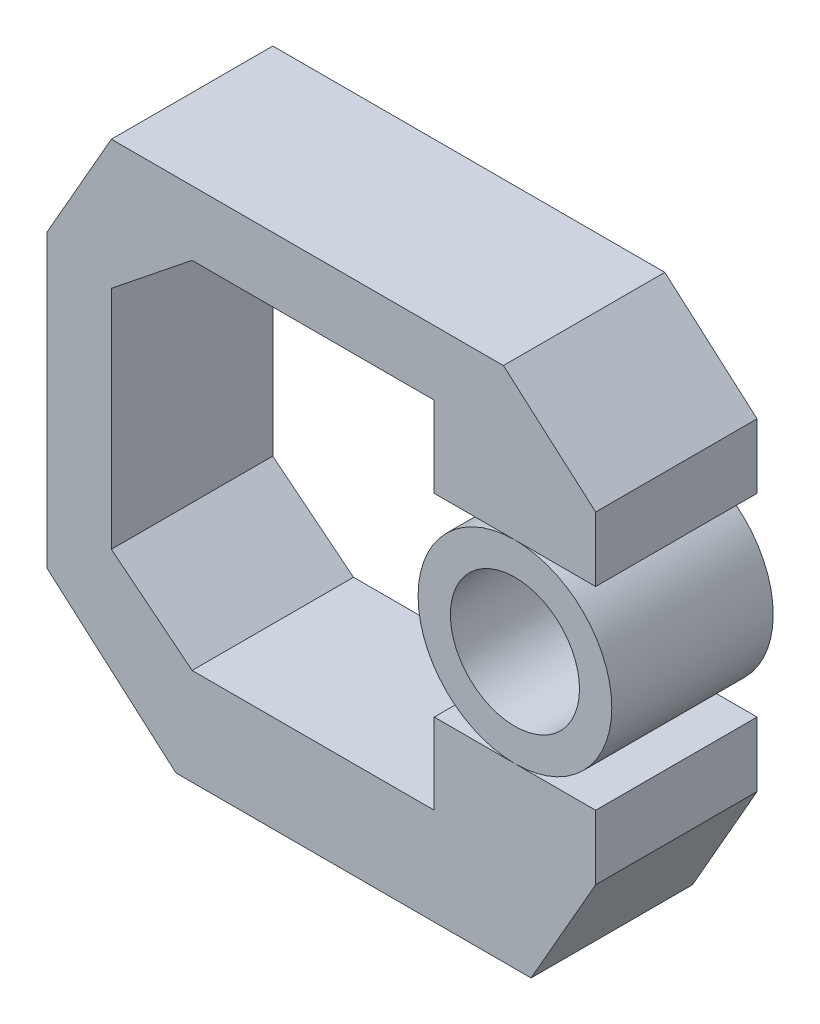
ISO-10303-21;
HEADER;
FILE_DESCRIPTION(('STEP AP214'),'2;1');
FILE_NAME('part.step','',(''),(''),'','','');
FILE_SCHEMA(('AUTOMOTIVE_DESIGN { 1 0 10303 214 1 1 1 1 }'));
ENDSEC;
DATA;
#1=APPLICATION_CONTEXT('core data for automotive mechanical design processes');
#2=APPLICATION_PROTOCOL_DEFINITION('international standard','automotive_design',2000,#1);
#3=PRODUCT_CONTEXT('',#1,'mechanical');
#4=PRODUCT('Part','Part','',(#3));
#5=PRODUCT_RELATED_PRODUCT_CATEGORY('part','',(#4));
#6=PRODUCT_DEFINITION_FORMATION('','',#4);
#7=PRODUCT_DEFINITION_CONTEXT('part definition',#1,'design');
#8=PRODUCT_DEFINITION('design','',#6,#7);
#9=PRODUCT_DEFINITION_SHAPE('','',#8);
#10=(LENGTH_UNIT() NAMED_UNIT(*) SI_UNIT(.MILLI.,.METRE.));
#11=(NAMED_UNIT(*) PLANE_ANGLE_UNIT() SI_UNIT($,.RADIAN.));
#12=(NAMED_UNIT(*) SI_UNIT($,.STERADIAN.) SOLID_ANGLE_UNIT());
#13=UNCERTAINTY_MEASURE_WITH_UNIT(LENGTH_MEASURE(1.E-05),#10,'distance_accuracy_value','');
#14=(GEOMETRIC_REPRESENTATION_CONTEXT(3) GLOBAL_UNCERTAINTY_ASSIGNED_CONTEXT((#13)) GLOBAL_UNIT_ASSIGNED_CONTEXT((#10,
#11,#12)) REPRESENTATION_CONTEXT('',''));
#15=CARTESIAN_POINT('',(0.,0.,0.));
#16=DIRECTION('',(0.,0.,1.));
#17=DIRECTION('',(1.,0.,0.));
#18=AXIS2_PLACEMENT_3D('',#15,#16,#17);
#19=CARTESIAN_POINT('',(0.,0.,5.));
#20=DIRECTION('',(0.,0.,-1.));
#21=DIRECTION('',(-1.,0.,0.));
#22=AXIS2_PLACEMENT_3D('',#19,#20,#21);
#23=CYLINDRICAL_SURFACE('',#22,4.);
#24=CARTESIAN_POINT('',(0.,0.,5.));
#25=DIRECTION('',(0.,0.,1.));
#26=DIRECTION('',(1.,0.,0.));
#27=AXIS2_PLACEMENT_3D('',#24,#25,#26);
#28=CIRCLE('',#27,4.);
#29=CARTESIAN_POINT('',(4.,0.,5.));
#30=VERTEX_POINT('',#29);
#31=EDGE_CURVE('E115',#30,#30,#28,.T.);
#32=ORIENTED_EDGE('',*,*,#31,.T.);
#33=EDGE_LOOP('',(#32));
#34=FACE_BOUND('',#33,.T.);
#35=CARTESIAN_POINT('',(0.,0.,-5.));
#36=DIRECTION('',(0.,0.,1.));
#37=DIRECTION('',(1.,0.,0.));
#38=AXIS2_PLACEMENT_3D('',#35,#36,#37);
#39=CIRCLE('',#38,4.);
#40=CARTESIAN_POINT('',(4.,0.,-5.));
#41=VERTEX_POINT('',#40);
#42=EDGE_CURVE('E121',#41,#41,#39,.T.);
#43=ORIENTED_EDGE('',*,*,#42,.F.);
#44=EDGE_LOOP('',(#43));
#45=FACE_BOUND('',#44,.T.);
#46=ADVANCED_FACE('F108',(#34,#45),#23,.F.);
#47=CARTESIAN_POINT('',(0.,0.,5.));
#48=DIRECTION('',(0.,0.,-1.));
#49=DIRECTION('',(-1.,0.,0.));
#50=AXIS2_PLACEMENT_3D('',#47,#48,#49);
#51=CYLINDRICAL_SURFACE('',#50,6.);
#52=CARTESIAN_POINT('',(0.,0.,5.));
#53=DIRECTION('',(0.,0.,1.));
#54=DIRECTION('',(1.,0.,0.));
#55=AXIS2_PLACEMENT_3D('',#52,#53,#54);
#56=CIRCLE('',#55,6.);
#57=CARTESIAN_POINT('',(6.,0.,5.));
#58=VERTEX_POINT('',#57);
#59=EDGE_CURVE('E12',#58,#58,#56,.T.);
#60=ORIENTED_EDGE('',*,*,#59,.F.);
#61=EDGE_LOOP('',(#60));
#62=FACE_BOUND('',#61,.T.);
#63=CARTESIAN_POINT('',(0.,0.,-5.));
#64=DIRECTION('',(0.,0.,1.));
#65=DIRECTION('',(1.,0.,0.));
#66=AXIS2_PLACEMENT_3D('',#63,#64,#65);
#67=CIRCLE('',#66,6.);
#68=CARTESIAN_POINT('',(6.,0.,-5.));
#69=VERTEX_POINT('',#68);
#70=EDGE_CURVE('E111',#69,#69,#67,.T.);
#71=ORIENTED_EDGE('',*,*,#70,.T.);
#72=EDGE_LOOP('',(#71));
#73=FACE_BOUND('',#72,.T.);
#74=ADVANCED_FACE('F128',(#62,#73),#51,.T.);
#75=CARTESIAN_POINT('',(0.,0.,5.));
#76=DIRECTION('',(0.,0.,1.));
#77=DIRECTION('',(1.,0.,0.));
#78=AXIS2_PLACEMENT_3D('',#75,#76,#77);
#79=PLANE('',#78);
#80=ORIENTED_EDGE('',*,*,#31,.F.);
#81=EDGE_LOOP('',(#80));
#82=FACE_BOUND('',#81,.T.);
#83=ORIENTED_EDGE('',*,*,#59,.T.);
#84=EDGE_LOOP('',(#83));
#85=FACE_BOUND('',#84,.T.);
#86=ADVANCED_FACE('F132',(#82,#85),#79,.T.);
#87=CARTESIAN_POINT('',(0.,0.,-5.));
#88=DIRECTION('',(0.,0.,1.));
#89=DIRECTION('',(1.,0.,0.));
#90=AXIS2_PLACEMENT_3D('',#87,#88,#89);
#91=PLANE('',#90);
#92=ORIENTED_EDGE('',*,*,#42,.T.);
#93=EDGE_LOOP('',(#92));
#94=FACE_BOUND('',#93,.T.);
#95=ORIENTED_EDGE('',*,*,#70,.F.);
#96=EDGE_LOOP('',(#95));
#97=FACE_BOUND('',#96,.T.);
#98=ADVANCED_FACE('F130',(#94,#97),#91,.F.);
#99=CLOSED_SHELL('',(#46,#74,#86,#98));
#100=MANIFOLD_SOLID_BREP('B2',#99);
#101=CARTESIAN_POINT('',(0.,11.,5.));
#102=DIRECTION('',(0.,-1.,0.));
#103=DIRECTION('',(1.,0.,0.));
#104=AXIS2_PLACEMENT_3D('',#101,#102,#103);
#105=PLANE('',#104);
#106=DIRECTION('',(-1.,0.,0.));
#107=VECTOR('',#106,1.);
#108=CARTESIAN_POINT('',(0.,11.,-5.));
#109=LINE('',#108,#107);
#110=CARTESIAN_POINT('',(-5.,11.,-5.));
#111=VERTEX_POINT('',#110);
#112=CARTESIAN_POINT('',(-20.,11.,-5.));
#113=VERTEX_POINT('',#112);
#114=EDGE_CURVE('E335',#111,#113,#109,.T.);
#115=ORIENTED_EDGE('',*,*,#114,.F.);
#116=DIRECTION('',(0.,0.,-1.));
#117=VECTOR('',#116,1.);
#118=CARTESIAN_POINT('',(-5.,11.,5.));
#119=LINE('',#118,#117);
#120=CARTESIAN_POINT('',(-5.,11.,5.));
#121=VERTEX_POINT('',#120);
#122=EDGE_CURVE('E106',#121,#111,#119,.T.);
#123=ORIENTED_EDGE('',*,*,#122,.F.);
#124=DIRECTION('',(-1.,0.,0.));
#125=VECTOR('',#124,1.);
#126=CARTESIAN_POINT('',(0.,11.,5.));
#127=LINE('',#126,#125);
#128=CARTESIAN_POINT('',(-20.,11.,5.));
#129=VERTEX_POINT('',#128);
#130=EDGE_CURVE('E400',#121,#129,#127,.T.);
#131=ORIENTED_EDGE('',*,*,#130,.T.);
#132=DIRECTION('',(0.,0.,-1.));
#133=VECTOR('',#132,1.);
#134=CARTESIAN_POINT('',(-20.,11.,5.));
#135=LINE('',#134,#133);
#136=EDGE_CURVE('E260',#129,#113,#135,.T.);
#137=ORIENTED_EDGE('',*,*,#136,.T.);
#138=EDGE_LOOP('',(#115,#123,#131,#137));
#139=FACE_BOUND('',#138,.T.);
#140=ADVANCED_FACE('F178',(#139),#105,.T.);
#141=CARTESIAN_POINT('',(-5.,0.,5.));
#142=DIRECTION('',(-1.,0.,0.));
#143=DIRECTION('',(0.,-1.,0.));
#144=AXIS2_PLACEMENT_3D('',#141,#142,#143);
#145=PLANE('',#144);
#146=DIRECTION('',(0.,1.,0.));
#147=VECTOR('',#146,1.);
#148=CARTESIAN_POINT('',(-5.,0.,-5.));
#149=LINE('',#148,#147);
#150=CARTESIAN_POINT('',(-5.,6.,-5.));
#151=VERTEX_POINT('',#150);
#152=EDGE_CURVE('E339',#151,#111,#149,.T.);
#153=ORIENTED_EDGE('',*,*,#152,.F.);
#154=DIRECTION('',(0.,0.,-1.));
#155=VECTOR('',#154,1.);
#156=CARTESIAN_POINT('',(-5.,6.,5.));
#157=LINE('',#156,#155);
#158=CARTESIAN_POINT('',(-5.,6.,5.));
#159=VERTEX_POINT('',#158);
#160=EDGE_CURVE('E187',#159,#151,#157,.T.);
#161=ORIENTED_EDGE('',*,*,#160,.F.);
#162=DIRECTION('',(0.,1.,0.));
#163=VECTOR('',#162,1.);
#164=CARTESIAN_POINT('',(-5.,0.,5.));
#165=LINE('',#164,#163);
#166=EDGE_CURVE('E466',#159,#121,#165,.T.);
#167=ORIENTED_EDGE('',*,*,#166,.T.);
#168=ORIENTED_EDGE('',*,*,#122,.T.);
#169=EDGE_LOOP('',(#153,#161,#167,#168));
#170=FACE_BOUND('',#169,.T.);
#171=ADVANCED_FACE('F454',(#170),#145,.T.);
#172=CARTESIAN_POINT('',(0.,6.,5.));
#173=DIRECTION('',(0.,-1.,0.));
#174=DIRECTION('',(0.,0.,-1.));
#175=AXIS2_PLACEMENT_3D('',#172,#173,#174);
#176=PLANE('',#175);
#177=DIRECTION('',(-1.,0.,0.));
#178=VECTOR('',#177,1.);
#179=CARTESIAN_POINT('',(0.,6.,-5.));
#180=LINE('',#179,#178);
#181=CARTESIAN_POINT('',(5.,6.,-5.));
#182=VERTEX_POINT('',#181);
#183=EDGE_CURVE('E343',#182,#151,#180,.T.);
#184=ORIENTED_EDGE('',*,*,#183,.F.);
#185=DIRECTION('',(0.,0.,-1.));
#186=VECTOR('',#185,1.);
#187=CARTESIAN_POINT('',(5.,6.,5.));
#188=LINE('',#187,#186);
#189=CARTESIAN_POINT('',(5.,6.,5.));
#190=VERTEX_POINT('',#189);
#191=EDGE_CURVE('E441',#190,#182,#188,.T.);
#192=ORIENTED_EDGE('',*,*,#191,.F.);
#193=DIRECTION('',(-1.,0.,0.));
#194=VECTOR('',#193,1.);
#195=CARTESIAN_POINT('',(0.,6.,5.));
#196=LINE('',#195,#194);
#197=EDGE_CURVE('E450',#190,#159,#196,.T.);
#198=ORIENTED_EDGE('',*,*,#197,.T.);
#199=ORIENTED_EDGE('',*,*,#160,.T.);
#200=EDGE_LOOP('',(#184,#192,#198,#199));
#201=FACE_BOUND('',#200,.T.);
#202=ADVANCED_FACE('F448',(#201),#176,.T.);
#203=CARTESIAN_POINT('',(5.,0.,5.));
#204=DIRECTION('',(1.,0.,0.));
#205=DIRECTION('',(0.,1.,0.));
#206=AXIS2_PLACEMENT_3D('',#203,#204,#205);
#207=PLANE('',#206);
#208=DIRECTION('',(0.,-1.,0.));
#209=VECTOR('',#208,1.);
#210=CARTESIAN_POINT('',(5.,0.,-5.));
#211=LINE('',#210,#209);
#212=CARTESIAN_POINT('',(5.,10.,-5.));
#213=VERTEX_POINT('',#212);
#214=EDGE_CURVE('E347',#213,#182,#211,.T.);
#215=ORIENTED_EDGE('',*,*,#214,.F.);
#216=DIRECTION('',(0.,0.,-1.));
#217=VECTOR('',#216,1.);
#218=CARTESIAN_POINT('',(5.,10.,5.));
#219=LINE('',#218,#217);
#220=CARTESIAN_POINT('',(5.,10.,5.));
#221=VERTEX_POINT('',#220);
#222=EDGE_CURVE('E438',#221,#213,#219,.T.);
#223=ORIENTED_EDGE('',*,*,#222,.F.);
#224=DIRECTION('',(0.,-1.,0.));
#225=VECTOR('',#224,1.);
#226=CARTESIAN_POINT('',(5.,0.,5.));
#227=LINE('',#226,#225);
#228=EDGE_CURVE('E463',#221,#190,#227,.T.);
#229=ORIENTED_EDGE('',*,*,#228,.T.);
#230=ORIENTED_EDGE('',*,*,#191,.T.);
#231=EDGE_LOOP('',(#215,#223,#229,#230));
#232=FACE_BOUND('',#231,.T.);
#233=ADVANCED_FACE('F460',(#232),#207,.T.);
#234=CARTESIAN_POINT('',(7.12389380530973,8.14159292035398,5.));
#235=DIRECTION('',(0.658504607868518,0.752576694706878,0.));
#236=DIRECTION('',(-0.752576694706878,0.658504607868518,0.));
#237=AXIS2_PLACEMENT_3D('',#234,#235,#236);
#238=PLANE('',#237);
#239=DIRECTION('',(0.752576694706878,-0.658504607868518,0.));
#240=VECTOR('',#239,1.);
#241=CARTESIAN_POINT('',(7.12389380530973,8.14159292035398,-5.));
#242=LINE('',#241,#240);
#243=CARTESIAN_POINT('',(-0.714285714285711,15.,-5.));
#244=VERTEX_POINT('',#243);
#245=EDGE_CURVE('E351',#244,#213,#242,.T.);
#246=ORIENTED_EDGE('',*,*,#245,.F.);
#247=DIRECTION('',(0.,0.,-1.));
#248=VECTOR('',#247,1.);
#249=CARTESIAN_POINT('',(-0.714285714285711,15.,5.));
#250=LINE('',#249,#248);
#251=CARTESIAN_POINT('',(-0.714285714285711,15.,5.));
#252=VERTEX_POINT('',#251);
#253=EDGE_CURVE('E435',#252,#244,#250,.T.);
#254=ORIENTED_EDGE('',*,*,#253,.F.);
#255=DIRECTION('',(0.752576694706878,-0.658504607868518,0.));
#256=VECTOR('',#255,1.);
#257=CARTESIAN_POINT('',(7.12389380530973,8.14159292035398,5.));
#258=LINE('',#257,#256);
#259=EDGE_CURVE('E471',#252,#221,#258,.T.);
#260=ORIENTED_EDGE('',*,*,#259,.T.);
#261=ORIENTED_EDGE('',*,*,#222,.T.);
#262=EDGE_LOOP('',(#246,#254,#260,#261));
#263=FACE_BOUND('',#262,.T.);
#264=ADVANCED_FACE('F538',(#263),#238,.T.);
#265=CARTESIAN_POINT('',(0.,15.,5.));
#266=DIRECTION('',(0.,1.,0.));
#267=DIRECTION('',(0.,0.,1.));
#268=AXIS2_PLACEMENT_3D('',#265,#266,#267);
#269=PLANE('',#268);
#270=DIRECTION('',(1.,0.,0.));
#271=VECTOR('',#270,1.);
#272=CARTESIAN_POINT('',(0.,15.,-5.));
#273=LINE('',#272,#271);
#274=CARTESIAN_POINT('',(-25.,15.,-5.));
#275=VERTEX_POINT('',#274);
#276=EDGE_CURVE('E355',#275,#244,#273,.T.);
#277=ORIENTED_EDGE('',*,*,#276,.F.);
#278=DIRECTION('',(0.,0.,-1.));
#279=VECTOR('',#278,1.);
#280=CARTESIAN_POINT('',(-25.,15.,5.));
#281=LINE('',#280,#279);
#282=CARTESIAN_POINT('',(-25.,15.,5.));
#283=VERTEX_POINT('',#282);
#284=EDGE_CURVE('E432',#283,#275,#281,.T.);
#285=ORIENTED_EDGE('',*,*,#284,.F.);
#286=DIRECTION('',(1.,0.,0.));
#287=VECTOR('',#286,1.);
#288=CARTESIAN_POINT('',(0.,15.,5.));
#289=LINE('',#288,#287);
#290=EDGE_CURVE('E478',#283,#252,#289,.T.);
#291=ORIENTED_EDGE('',*,*,#290,.T.);
#292=ORIENTED_EDGE('',*,*,#253,.T.);
#293=EDGE_LOOP('',(#277,#285,#291,#292));
#294=FACE_BOUND('',#293,.T.);
#295=ADVANCED_FACE('F541',(#294),#269,.T.);
#296=CARTESIAN_POINT('',(-25.3076923076923,14.4615384615384,5.));
#297=DIRECTION('',(-0.86824314212446,0.496138938356833,0.));
#298=DIRECTION('',(-0.496138938356833,-0.86824314212446,0.));
#299=AXIS2_PLACEMENT_3D('',#296,#297,#298);
#300=PLANE('',#299);
#301=DIRECTION('',(0.496138938356833,0.86824314212446,0.));
#302=VECTOR('',#301,1.);
#303=CARTESIAN_POINT('',(-25.3076923076923,14.4615384615384,-5.));
#304=LINE('',#303,#302);
#305=CARTESIAN_POINT('',(-29.,7.99999999999999,-5.));
#306=VERTEX_POINT('',#305);
#307=EDGE_CURVE('E359',#306,#275,#304,.T.);
#308=ORIENTED_EDGE('',*,*,#307,.F.);
#309=DIRECTION('',(0.,0.,-1.));
#310=VECTOR('',#309,1.);
#311=CARTESIAN_POINT('',(-29.,7.99999999999999,5.));
#312=LINE('',#311,#310);
#313=CARTESIAN_POINT('',(-29.,7.99999999999999,5.));
#314=VERTEX_POINT('',#313);
#315=EDGE_CURVE('E429',#314,#306,#312,.T.);
#316=ORIENTED_EDGE('',*,*,#315,.F.);
#317=DIRECTION('',(0.496138938356833,0.86824314212446,0.));
#318=VECTOR('',#317,1.);
#319=CARTESIAN_POINT('',(-25.3076923076923,14.4615384615384,5.));
#320=LINE('',#319,#318);
#321=EDGE_CURVE('E482',#314,#283,#320,.T.);
#322=ORIENTED_EDGE('',*,*,#321,.T.);
#323=ORIENTED_EDGE('',*,*,#284,.T.);
#324=EDGE_LOOP('',(#308,#316,#322,#323));
#325=FACE_BOUND('',#324,.T.);
#326=ADVANCED_FACE('F545',(#325),#300,.T.);
#327=CARTESIAN_POINT('',(-29.,0.,5.));
#328=DIRECTION('',(-1.,0.,0.));
#329=DIRECTION('',(0.,-1.,0.));
#330=AXIS2_PLACEMENT_3D('',#327,#328,#329);
#331=PLANE('',#330);
#332=DIRECTION('',(0.,1.,0.));
#333=VECTOR('',#332,1.);
#334=CARTESIAN_POINT('',(-29.,0.,-5.));
#335=LINE('',#334,#333);
#336=CARTESIAN_POINT('',(-29.,-10.,-5.));
#337=VERTEX_POINT('',#336);
#338=EDGE_CURVE('E363',#337,#306,#335,.T.);
#339=ORIENTED_EDGE('',*,*,#338,.F.);
#340=DIRECTION('',(0.,0.,-1.));
#341=VECTOR('',#340,1.);
#342=CARTESIAN_POINT('',(-29.,-10.,5.));
#343=LINE('',#342,#341);
#344=CARTESIAN_POINT('',(-29.,-10.,5.));
#345=VERTEX_POINT('',#344);
#346=EDGE_CURVE('E426',#345,#337,#343,.T.);
#347=ORIENTED_EDGE('',*,*,#346,.F.);
#348=DIRECTION('',(0.,1.,0.));
#349=VECTOR('',#348,1.);
#350=CARTESIAN_POINT('',(-29.,0.,5.));
#351=LINE('',#350,#349);
#352=EDGE_CURVE('E486',#345,#314,#351,.T.);
#353=ORIENTED_EDGE('',*,*,#352,.T.);
#354=ORIENTED_EDGE('',*,*,#315,.T.);
#355=EDGE_LOOP('',(#339,#347,#353,#354));
#356=FACE_BOUND('',#355,.T.);
#357=ADVANCED_FACE('F549',(#356),#331,.T.);
#358=CARTESIAN_POINT('',(-17.5309734513274,-20.0353982300885,5.));
#359=DIRECTION('',(-0.658504607868518,-0.752576694706878,0.));
#360=DIRECTION('',(0.752576694706878,-0.658504607868518,0.));
#361=AXIS2_PLACEMENT_3D('',#358,#359,#360);
#362=PLANE('',#361);
#363=DIRECTION('',(-0.752576694706878,0.658504607868518,0.));
#364=VECTOR('',#363,1.);
#365=CARTESIAN_POINT('',(-17.5309734513274,-20.0353982300885,-5.));
#366=LINE('',#365,#364);
#367=CARTESIAN_POINT('',(-21.,-17.,-5.));
#368=VERTEX_POINT('',#367);
#369=EDGE_CURVE('E367',#368,#337,#366,.T.);
#370=ORIENTED_EDGE('',*,*,#369,.F.);
#371=DIRECTION('',(0.,0.,-1.));
#372=VECTOR('',#371,1.);
#373=CARTESIAN_POINT('',(-21.,-17.,5.));
#374=LINE('',#373,#372);
#375=CARTESIAN_POINT('',(-21.,-17.,5.));
#376=VERTEX_POINT('',#375);
#377=EDGE_CURVE('E423',#376,#368,#374,.T.);
#378=ORIENTED_EDGE('',*,*,#377,.F.);
#379=DIRECTION('',(-0.752576694706878,0.658504607868518,0.));
#380=VECTOR('',#379,1.);
#381=CARTESIAN_POINT('',(-17.5309734513274,-20.0353982300885,5.));
#382=LINE('',#381,#380);
#383=EDGE_CURVE('E490',#376,#345,#382,.T.);
#384=ORIENTED_EDGE('',*,*,#383,.T.);
#385=ORIENTED_EDGE('',*,*,#346,.T.);
#386=EDGE_LOOP('',(#370,#378,#384,#385));
#387=FACE_BOUND('',#386,.T.);
#388=ADVANCED_FACE('F553',(#387),#362,.T.);
#389=CARTESIAN_POINT('',(0.,-17.,5.));
#390=DIRECTION('',(0.,-1.,0.));
#391=DIRECTION('',(1.,0.,0.));
#392=AXIS2_PLACEMENT_3D('',#389,#390,#391);
#393=PLANE('',#392);
#394=DIRECTION('',(-1.,0.,0.));
#395=VECTOR('',#394,1.);
#396=CARTESIAN_POINT('',(0.,-17.,-5.));
#397=LINE('',#396,#395);
#398=CARTESIAN_POINT('',(1.,-17.,-5.));
#399=VERTEX_POINT('',#398);
#400=EDGE_CURVE('E371',#399,#368,#397,.T.);
#401=ORIENTED_EDGE('',*,*,#400,.F.);
#402=DIRECTION('',(0.,0.,-1.));
#403=VECTOR('',#402,1.);
#404=CARTESIAN_POINT('',(1.,-17.,5.));
#405=LINE('',#404,#403);
#406=CARTESIAN_POINT('',(1.,-17.,5.));
#407=VERTEX_POINT('',#406);
#408=EDGE_CURVE('E420',#407,#399,#405,.T.);
#409=ORIENTED_EDGE('',*,*,#408,.F.);
#410=DIRECTION('',(-1.,0.,0.));
#411=VECTOR('',#410,1.);
#412=CARTESIAN_POINT('',(0.,-17.,5.));
#413=LINE('',#412,#411);
#414=EDGE_CURVE('E494',#407,#376,#413,.T.);
#415=ORIENTED_EDGE('',*,*,#414,.T.);
#416=ORIENTED_EDGE('',*,*,#377,.T.);
#417=EDGE_LOOP('',(#401,#409,#415,#416));
#418=FACE_BOUND('',#417,.T.);
#419=ADVANCED_FACE('F557',(#418),#393,.T.);
#420=CARTESIAN_POINT('',(8.07692307692308,-4.61538461538461,5.));
#421=DIRECTION('',(0.868243142124459,-0.496138938356834,0.));
#422=DIRECTION('',(0.496138938356834,0.868243142124459,0.));
#423=AXIS2_PLACEMENT_3D('',#420,#421,#422);
#424=PLANE('',#423);
#425=DIRECTION('',(-0.496138938356834,-0.868243142124459,0.));
#426=VECTOR('',#425,1.);
#427=CARTESIAN_POINT('',(8.07692307692308,-4.61538461538461,-5.));
#428=LINE('',#427,#426);
#429=CARTESIAN_POINT('',(5.,-10.,-5.));
#430=VERTEX_POINT('',#429);
#431=EDGE_CURVE('E375',#430,#399,#428,.T.);
#432=ORIENTED_EDGE('',*,*,#431,.F.);
#433=DIRECTION('',(0.,0.,-1.));
#434=VECTOR('',#433,1.);
#435=CARTESIAN_POINT('',(5.,-10.,5.));
#436=LINE('',#435,#434);
#437=CARTESIAN_POINT('',(5.,-10.,5.));
#438=VERTEX_POINT('',#437);
#439=EDGE_CURVE('E417',#438,#430,#436,.T.);
#440=ORIENTED_EDGE('',*,*,#439,.F.);
#441=DIRECTION('',(-0.496138938356834,-0.868243142124459,0.));
#442=VECTOR('',#441,1.);
#443=CARTESIAN_POINT('',(8.07692307692308,-4.61538461538461,5.));
#444=LINE('',#443,#442);
#445=EDGE_CURVE('E498',#438,#407,#444,.T.);
#446=ORIENTED_EDGE('',*,*,#445,.T.);
#447=ORIENTED_EDGE('',*,*,#408,.T.);
#448=EDGE_LOOP('',(#432,#440,#446,#447));
#449=FACE_BOUND('',#448,.T.);
#450=ADVANCED_FACE('F561',(#449),#424,.T.);
#451=CARTESIAN_POINT('',(5.,0.,5.));
#452=DIRECTION('',(1.,0.,0.));
#453=DIRECTION('',(0.,0.,-1.));
#454=AXIS2_PLACEMENT_3D('',#451,#452,#453);
#455=PLANE('',#454);
#456=DIRECTION('',(0.,-1.,0.));
#457=VECTOR('',#456,1.);
#458=CARTESIAN_POINT('',(5.,0.,-5.));
#459=LINE('',#458,#457);
#460=CARTESIAN_POINT('',(5.,-6.,-5.));
#461=VERTEX_POINT('',#460);
#462=EDGE_CURVE('E379',#461,#430,#459,.T.);
#463=ORIENTED_EDGE('',*,*,#462,.F.);
#464=DIRECTION('',(0.,0.,-1.));
#465=VECTOR('',#464,1.);
#466=CARTESIAN_POINT('',(5.,-6.,5.));
#467=LINE('',#466,#465);
#468=CARTESIAN_POINT('',(5.,-6.,5.));
#469=VERTEX_POINT('',#468);
#470=EDGE_CURVE('E414',#469,#461,#467,.T.);
#471=ORIENTED_EDGE('',*,*,#470,.F.);
#472=DIRECTION('',(0.,-1.,0.));
#473=VECTOR('',#472,1.);
#474=CARTESIAN_POINT('',(5.,0.,5.));
#475=LINE('',#474,#473);
#476=EDGE_CURVE('E502',#469,#438,#475,.T.);
#477=ORIENTED_EDGE('',*,*,#476,.T.);
#478=ORIENTED_EDGE('',*,*,#439,.T.);
#479=EDGE_LOOP('',(#463,#471,#477,#478));
#480=FACE_BOUND('',#479,.T.);
#481=ADVANCED_FACE('F565',(#480),#455,.T.);
#482=CARTESIAN_POINT('',(0.,-6.,5.));
#483=DIRECTION('',(0.,1.,0.));
#484=DIRECTION('',(-1.,0.,0.));
#485=AXIS2_PLACEMENT_3D('',#482,#483,#484);
#486=PLANE('',#485);
#487=DIRECTION('',(1.,0.,0.));
#488=VECTOR('',#487,1.);
#489=CARTESIAN_POINT('',(0.,-6.,-5.));
#490=LINE('',#489,#488);
#491=CARTESIAN_POINT('',(-5.,-6.,-5.));
#492=VERTEX_POINT('',#491);
#493=EDGE_CURVE('E383',#492,#461,#490,.T.);
#494=ORIENTED_EDGE('',*,*,#493,.F.);
#495=DIRECTION('',(0.,0.,-1.));
#496=VECTOR('',#495,1.);
#497=CARTESIAN_POINT('',(-5.,-6.,5.));
#498=LINE('',#497,#496);
#499=CARTESIAN_POINT('',(-5.,-6.,5.));
#500=VERTEX_POINT('',#499);
#501=EDGE_CURVE('E411',#500,#492,#498,.T.);
#502=ORIENTED_EDGE('',*,*,#501,.F.);
#503=DIRECTION('',(1.,0.,0.));
#504=VECTOR('',#503,1.);
#505=CARTESIAN_POINT('',(0.,-6.,5.));
#506=LINE('',#505,#504);
#507=EDGE_CURVE('E506',#500,#469,#506,.T.);
#508=ORIENTED_EDGE('',*,*,#507,.T.);
#509=ORIENTED_EDGE('',*,*,#470,.T.);
#510=EDGE_LOOP('',(#494,#502,#508,#509));
#511=FACE_BOUND('',#510,.T.);
#512=ADVANCED_FACE('F569',(#511),#486,.T.);
#513=CARTESIAN_POINT('',(-5.,0.,5.));
#514=DIRECTION('',(1.,0.,0.));
#515=DIRECTION('',(0.,0.,-1.));
#516=AXIS2_PLACEMENT_3D('',#513,#514,#515);
#517=PLANE('',#516);
#518=DIRECTION('',(0.,-1.,0.));
#519=VECTOR('',#518,1.);
#520=CARTESIAN_POINT('',(-5.,0.,-5.));
#521=LINE('',#520,#519);
#522=CARTESIAN_POINT('',(-5.,-11.,-5.));
#523=VERTEX_POINT('',#522);
#524=EDGE_CURVE('E387',#492,#523,#521,.T.);
#525=ORIENTED_EDGE('',*,*,#524,.T.);
#526=DIRECTION('',(0.,0.,-1.));
#527=VECTOR('',#526,1.);
#528=CARTESIAN_POINT('',(-5.,-11.,5.));
#529=LINE('',#528,#527);
#530=CARTESIAN_POINT('',(-5.,-11.,5.));
#531=VERTEX_POINT('',#530);
#532=EDGE_CURVE('E407',#531,#523,#529,.T.);
#533=ORIENTED_EDGE('',*,*,#532,.F.);
#534=DIRECTION('',(0.,-1.,0.));
#535=VECTOR('',#534,1.);
#536=CARTESIAN_POINT('',(-5.,0.,5.));
#537=LINE('',#536,#535);
#538=EDGE_CURVE('E510',#500,#531,#537,.T.);
#539=ORIENTED_EDGE('',*,*,#538,.F.);
#540=ORIENTED_EDGE('',*,*,#501,.T.);
#541=EDGE_LOOP('',(#525,#533,#539,#540));
#542=FACE_BOUND('',#541,.T.);
#543=ADVANCED_FACE('F518',(#542),#517,.F.);
#544=CARTESIAN_POINT('',(0.,-11.,5.));
#545=DIRECTION('',(0.,-1.,0.));
#546=DIRECTION('',(1.,0.,0.));
#547=AXIS2_PLACEMENT_3D('',#544,#545,#546);
#548=PLANE('',#547);
#549=DIRECTION('',(-1.,0.,0.));
#550=VECTOR('',#549,1.);
#551=CARTESIAN_POINT('',(0.,-11.,-5.));
#552=LINE('',#551,#550);
#553=CARTESIAN_POINT('',(-20.,-11.,-5.));
#554=VERTEX_POINT('',#553);
#555=EDGE_CURVE('E390',#523,#554,#552,.T.);
#556=ORIENTED_EDGE('',*,*,#555,.T.);
#557=DIRECTION('',(0.,0.,-1.));
#558=VECTOR('',#557,1.);
#559=CARTESIAN_POINT('',(-20.,-11.,5.));
#560=LINE('',#559,#558);
#561=CARTESIAN_POINT('',(-20.,-11.,5.));
#562=VERTEX_POINT('',#561);
#563=EDGE_CURVE('E325',#562,#554,#560,.T.);
#564=ORIENTED_EDGE('',*,*,#563,.F.);
#565=DIRECTION('',(-1.,0.,0.));
#566=VECTOR('',#565,1.);
#567=CARTESIAN_POINT('',(0.,-11.,5.));
#568=LINE('',#567,#566);
#569=EDGE_CURVE('E314',#531,#562,#568,.T.);
#570=ORIENTED_EDGE('',*,*,#569,.F.);
#571=ORIENTED_EDGE('',*,*,#532,.T.);
#572=EDGE_LOOP('',(#556,#564,#570,#571));
#573=FACE_BOUND('',#572,.T.);
#574=ADVANCED_FACE('F522',(#573),#548,.F.);
#575=CARTESIAN_POINT('',(-13.1707317073171,-16.4634146341463,5.));
#576=DIRECTION('',(-0.624695047554424,-0.78086880944303,0.));
#577=DIRECTION('',(0.78086880944303,-0.624695047554424,0.));
#578=AXIS2_PLACEMENT_3D('',#575,#576,#577);
#579=PLANE('',#578);
#580=DIRECTION('',(-0.78086880944303,0.624695047554424,0.));
#581=VECTOR('',#580,1.);
#582=CARTESIAN_POINT('',(-13.1707317073171,-16.4634146341463,-5.));
#583=LINE('',#582,#581);
#584=CARTESIAN_POINT('',(-25.,-7.,-5.));
#585=VERTEX_POINT('',#584);
#586=EDGE_CURVE('E323',#554,#585,#583,.T.);
#587=ORIENTED_EDGE('',*,*,#586,.T.);
#588=DIRECTION('',(0.,0.,-1.));
#589=VECTOR('',#588,1.);
#590=CARTESIAN_POINT('',(-25.,-7.,5.));
#591=LINE('',#590,#589);
#592=CARTESIAN_POINT('',(-25.,-7.,5.));
#593=VERTEX_POINT('',#592);
#594=EDGE_CURVE('E320',#593,#585,#591,.T.);
#595=ORIENTED_EDGE('',*,*,#594,.F.);
#596=DIRECTION('',(-0.78086880944303,0.624695047554424,0.));
#597=VECTOR('',#596,1.);
#598=CARTESIAN_POINT('',(-13.1707317073171,-16.4634146341463,5.));
#599=LINE('',#598,#597);
#600=EDGE_CURVE('E308',#562,#593,#599,.T.);
#601=ORIENTED_EDGE('',*,*,#600,.F.);
#602=ORIENTED_EDGE('',*,*,#563,.T.);
#603=EDGE_LOOP('',(#587,#595,#601,#602));
#604=FACE_BOUND('',#603,.T.);
#605=ADVANCED_FACE('F321',(#604),#579,.F.);
#606=CARTESIAN_POINT('',(-25.,0.,5.));
#607=DIRECTION('',(-1.,0.,0.));
#608=DIRECTION('',(0.,0.,1.));
#609=AXIS2_PLACEMENT_3D('',#606,#607,#608);
#610=PLANE('',#609);
#611=DIRECTION('',(0.,1.,0.));
#612=VECTOR('',#611,1.);
#613=CARTESIAN_POINT('',(-25.,0.,-5.));
#614=LINE('',#613,#612);
#615=CARTESIAN_POINT('',(-25.,7.,-5.));
#616=VERTEX_POINT('',#615);
#617=EDGE_CURVE('E253',#585,#616,#614,.T.);
#618=ORIENTED_EDGE('',*,*,#617,.T.);
#619=DIRECTION('',(0.,0.,-1.));
#620=VECTOR('',#619,1.);
#621=CARTESIAN_POINT('',(-25.,7.,5.));
#622=LINE('',#621,#620);
#623=CARTESIAN_POINT('',(-25.,7.,5.));
#624=VERTEX_POINT('',#623);
#625=EDGE_CURVE('E326',#624,#616,#622,.T.);
#626=ORIENTED_EDGE('',*,*,#625,.F.);
#627=DIRECTION('',(0.,1.,0.));
#628=VECTOR('',#627,1.);
#629=CARTESIAN_POINT('',(-25.,0.,5.));
#630=LINE('',#629,#628);
#631=EDGE_CURVE('E312',#593,#624,#630,.T.);
#632=ORIENTED_EDGE('',*,*,#631,.F.);
#633=ORIENTED_EDGE('',*,*,#594,.T.);
#634=EDGE_LOOP('',(#618,#626,#632,#633));
#635=FACE_BOUND('',#634,.T.);
#636=ADVANCED_FACE('F328',(#635),#610,.F.);
#637=CARTESIAN_POINT('',(-13.170731707317,16.4634146341463,5.));
#638=DIRECTION('',(-0.624695047554423,0.780868809443031,0.));
#639=DIRECTION('',(-0.780868809443031,-0.624695047554423,0.));
#640=AXIS2_PLACEMENT_3D('',#637,#638,#639);
#641=PLANE('',#640);
#642=DIRECTION('',(0.780868809443031,0.624695047554423,0.));
#643=VECTOR('',#642,1.);
#644=CARTESIAN_POINT('',(-13.170731707317,16.4634146341463,-5.));
#645=LINE('',#644,#643);
#646=EDGE_CURVE('E397',#616,#113,#645,.T.);
#647=ORIENTED_EDGE('',*,*,#646,.T.);
#648=ORIENTED_EDGE('',*,*,#136,.F.);
#649=DIRECTION('',(0.780868809443031,0.624695047554423,0.));
#650=VECTOR('',#649,1.);
#651=CARTESIAN_POINT('',(-13.170731707317,16.4634146341463,5.));
#652=LINE('',#651,#650);
#653=EDGE_CURVE('E195',#624,#129,#652,.T.);
#654=ORIENTED_EDGE('',*,*,#653,.F.);
#655=ORIENTED_EDGE('',*,*,#625,.T.);
#656=EDGE_LOOP('',(#647,#648,#654,#655));
#657=FACE_BOUND('',#656,.T.);
#658=ADVANCED_FACE('F525',(#657),#641,.F.);
#659=CARTESIAN_POINT('',(0.,0.,5.));
#660=DIRECTION('',(0.,0.,1.));
#661=DIRECTION('',(1.,0.,0.));
#662=AXIS2_PLACEMENT_3D('',#659,#660,#661);
#663=PLANE('',#662);
#664=ORIENTED_EDGE('',*,*,#130,.F.);
#665=ORIENTED_EDGE('',*,*,#166,.F.);
#666=ORIENTED_EDGE('',*,*,#197,.F.);
#667=ORIENTED_EDGE('',*,*,#228,.F.);
#668=ORIENTED_EDGE('',*,*,#259,.F.);
#669=ORIENTED_EDGE('',*,*,#290,.F.);
#670=ORIENTED_EDGE('',*,*,#321,.F.);
#671=ORIENTED_EDGE('',*,*,#352,.F.);
#672=ORIENTED_EDGE('',*,*,#383,.F.);
#673=ORIENTED_EDGE('',*,*,#414,.F.);
#674=ORIENTED_EDGE('',*,*,#445,.F.);
#675=ORIENTED_EDGE('',*,*,#476,.F.);
#676=ORIENTED_EDGE('',*,*,#507,.F.);
#677=ORIENTED_EDGE('',*,*,#538,.T.);
#678=ORIENTED_EDGE('',*,*,#569,.T.);
#679=ORIENTED_EDGE('',*,*,#600,.T.);
#680=ORIENTED_EDGE('',*,*,#631,.T.);
#681=ORIENTED_EDGE('',*,*,#653,.T.);
#682=EDGE_LOOP('',(#664,#665,#666,#667,#668,#669,#670,#671,#672,#673,#674,#675,#676,#677,#678,
#679,#680,#681));
#683=FACE_BOUND('',#682,.T.);
#684=ADVANCED_FACE('F310',(#683),#663,.T.);
#685=CARTESIAN_POINT('',(0.,0.,-5.));
#686=DIRECTION('',(0.,0.,1.));
#687=DIRECTION('',(1.,0.,0.));
#688=AXIS2_PLACEMENT_3D('',#685,#686,#687);
#689=PLANE('',#688);
#690=ORIENTED_EDGE('',*,*,#114,.T.);
#691=ORIENTED_EDGE('',*,*,#646,.F.);
#692=ORIENTED_EDGE('',*,*,#617,.F.);
#693=ORIENTED_EDGE('',*,*,#586,.F.);
#694=ORIENTED_EDGE('',*,*,#555,.F.);
#695=ORIENTED_EDGE('',*,*,#524,.F.);
#696=ORIENTED_EDGE('',*,*,#493,.T.);
#697=ORIENTED_EDGE('',*,*,#462,.T.);
#698=ORIENTED_EDGE('',*,*,#431,.T.);
#699=ORIENTED_EDGE('',*,*,#400,.T.);
#700=ORIENTED_EDGE('',*,*,#369,.T.);
#701=ORIENTED_EDGE('',*,*,#338,.T.);
#702=ORIENTED_EDGE('',*,*,#307,.T.);
#703=ORIENTED_EDGE('',*,*,#276,.T.);
#704=ORIENTED_EDGE('',*,*,#245,.T.);
#705=ORIENTED_EDGE('',*,*,#214,.T.);
#706=ORIENTED_EDGE('',*,*,#183,.T.);
#707=ORIENTED_EDGE('',*,*,#152,.T.);
#708=EDGE_LOOP('',(#690,#691,#692,#693,#694,#695,#696,#697,#698,#699,#700,#701,#702,#703,#704,
#705,#706,#707));
#709=FACE_BOUND('',#708,.T.);
#710=ADVANCED_FACE('F456',(#709),#689,.F.);
#711=CLOSED_SHELL('',(#140,#171,#202,#233,#264,#295,#326,#357,#388,#419,#450,#481,#512,#543,
#574,#605,#636,#658,#684,#710));
#712=MANIFOLD_SOLID_BREP('B7',#711);
#713=ADVANCED_BREP_SHAPE_REPRESENTATION('',(#18,#100,#712),#14);
#714=SHAPE_DEFINITION_REPRESENTATION(#9,#713);
ENDSEC;
END-ISO-10303-21;
